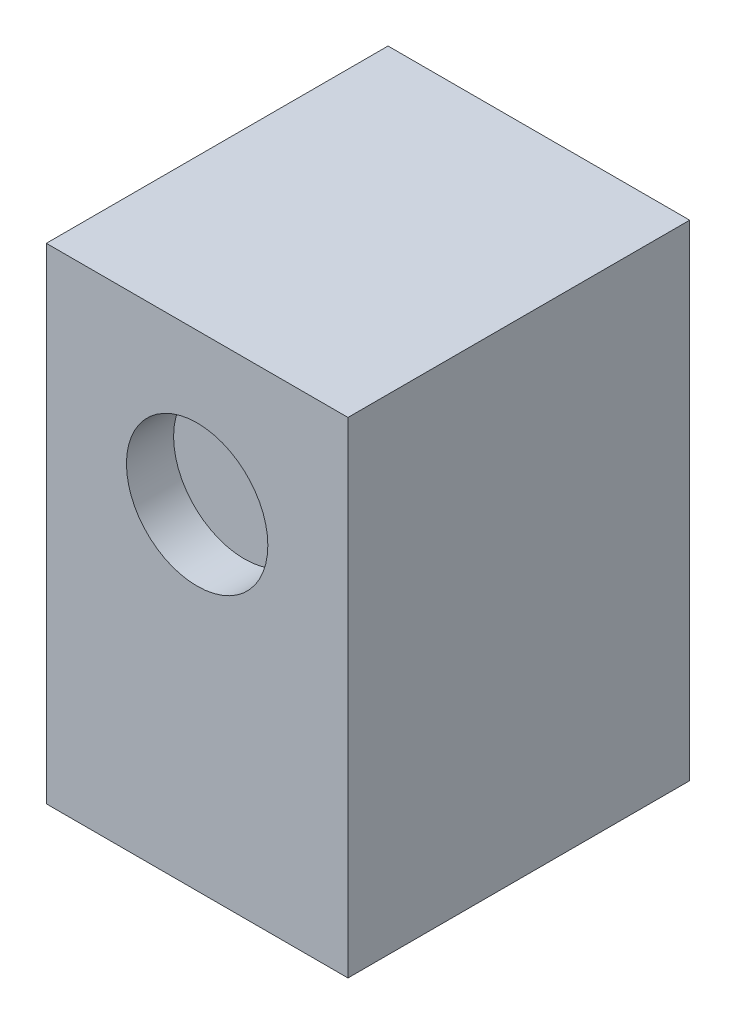
ISO-10303-21;
HEADER;
FILE_DESCRIPTION(('STEP AP214'),'2;1');
FILE_NAME('part.step','',(''),(''),'','','');
FILE_SCHEMA(('AUTOMOTIVE_DESIGN { 1 0 10303 214 1 1 1 1 }'));
ENDSEC;
DATA;
#1=APPLICATION_CONTEXT('core data for automotive mechanical design processes');
#2=APPLICATION_PROTOCOL_DEFINITION('international standard','automotive_design',2000,#1);
#3=PRODUCT_CONTEXT('',#1,'mechanical');
#4=PRODUCT('Part','Part','',(#3));
#5=PRODUCT_RELATED_PRODUCT_CATEGORY('part','',(#4));
#6=PRODUCT_DEFINITION_FORMATION('','',#4);
#7=PRODUCT_DEFINITION_CONTEXT('part definition',#1,'design');
#8=PRODUCT_DEFINITION('design','',#6,#7);
#9=PRODUCT_DEFINITION_SHAPE('','',#8);
#10=(LENGTH_UNIT() NAMED_UNIT(*) SI_UNIT(.MILLI.,.METRE.));
#11=(NAMED_UNIT(*) PLANE_ANGLE_UNIT() SI_UNIT($,.RADIAN.));
#12=(NAMED_UNIT(*) SI_UNIT($,.STERADIAN.) SOLID_ANGLE_UNIT());
#13=UNCERTAINTY_MEASURE_WITH_UNIT(LENGTH_MEASURE(1.E-05),#10,'distance_accuracy_value','');
#14=(GEOMETRIC_REPRESENTATION_CONTEXT(3) GLOBAL_UNCERTAINTY_ASSIGNED_CONTEXT((#13)) GLOBAL_UNIT_ASSIGNED_CONTEXT((#10,
#11,#12)) REPRESENTATION_CONTEXT('',''));
#15=CARTESIAN_POINT('',(0.,0.,0.));
#16=DIRECTION('',(0.,0.,1.));
#17=DIRECTION('',(1.,0.,0.));
#18=AXIS2_PLACEMENT_3D('',#15,#16,#17);
#19=CARTESIAN_POINT('',(32.,103.,36.25));
#20=DIRECTION('',(-1.,0.,0.));
#21=DIRECTION('',(0.,0.,1.));
#22=AXIS2_PLACEMENT_3D('',#19,#20,#21);
#23=PLANE('',#22);
#24=DIRECTION('',(0.,0.,-1.));
#25=VECTOR('',#24,1.);
#26=CARTESIAN_POINT('',(32.,0.,36.25));
#27=LINE('',#26,#25);
#28=CARTESIAN_POINT('',(32.,0.,36.25));
#29=VERTEX_POINT('',#28);
#30=CARTESIAN_POINT('',(32.,0.,-36.25));
#31=VERTEX_POINT('',#30);
#32=EDGE_CURVE('E99',#29,#31,#27,.T.);
#33=ORIENTED_EDGE('',*,*,#32,.T.);
#34=DIRECTION('',(0.,-1.,0.));
#35=VECTOR('',#34,1.);
#36=CARTESIAN_POINT('',(32.,103.,-36.25));
#37=LINE('',#36,#35);
#38=CARTESIAN_POINT('',(32.,103.,-36.25));
#39=VERTEX_POINT('',#38);
#40=EDGE_CURVE('E11',#39,#31,#37,.T.);
#41=ORIENTED_EDGE('',*,*,#40,.F.);
#42=DIRECTION('',(0.,0.,-1.));
#43=VECTOR('',#42,1.);
#44=CARTESIAN_POINT('',(32.,103.,36.25));
#45=LINE('',#44,#43);
#46=CARTESIAN_POINT('',(32.,103.,36.25));
#47=VERTEX_POINT('',#46);
#48=EDGE_CURVE('E87',#47,#39,#45,.T.);
#49=ORIENTED_EDGE('',*,*,#48,.F.);
#50=DIRECTION('',(0.,-1.,0.));
#51=VECTOR('',#50,1.);
#52=CARTESIAN_POINT('',(32.,103.,36.25));
#53=LINE('',#52,#51);
#54=EDGE_CURVE('E95',#47,#29,#53,.T.);
#55=ORIENTED_EDGE('',*,*,#54,.T.);
#56=EDGE_LOOP('',(#33,#41,#49,#55));
#57=FACE_BOUND('',#56,.T.);
#58=ADVANCED_FACE('F36',(#57),#23,.F.);
#59=CARTESIAN_POINT('',(-32.,103.,-36.25));
#60=DIRECTION('',(0.,0.,1.));
#61=DIRECTION('',(1.,0.,0.));
#62=AXIS2_PLACEMENT_3D('',#59,#60,#61);
#63=PLANE('',#62);
#64=DIRECTION('',(-1.,0.,0.));
#65=VECTOR('',#64,1.);
#66=CARTESIAN_POINT('',(-32.,0.,-36.25));
#67=LINE('',#66,#65);
#68=CARTESIAN_POINT('',(-32.,0.,-36.25));
#69=VERTEX_POINT('',#68);
#70=EDGE_CURVE('E91',#31,#69,#67,.T.);
#71=ORIENTED_EDGE('',*,*,#70,.T.);
#72=DIRECTION('',(0.,-1.,0.));
#73=VECTOR('',#72,1.);
#74=CARTESIAN_POINT('',(-32.,103.,-36.25));
#75=LINE('',#74,#73);
#76=CARTESIAN_POINT('',(-32.,103.,-36.25));
#77=VERTEX_POINT('',#76);
#78=EDGE_CURVE('E44',#77,#69,#75,.T.);
#79=ORIENTED_EDGE('',*,*,#78,.F.);
#80=DIRECTION('',(-1.,0.,0.));
#81=VECTOR('',#80,1.);
#82=CARTESIAN_POINT('',(-32.,103.,-36.25));
#83=LINE('',#82,#81);
#84=EDGE_CURVE('E82',#39,#77,#83,.T.);
#85=ORIENTED_EDGE('',*,*,#84,.F.);
#86=ORIENTED_EDGE('',*,*,#40,.T.);
#87=EDGE_LOOP('',(#71,#79,#85,#86));
#88=FACE_BOUND('',#87,.T.);
#89=ADVANCED_FACE('F90',(#88),#63,.F.);
#90=CARTESIAN_POINT('',(-32.,103.,36.25));
#91=DIRECTION('',(1.,0.,0.));
#92=DIRECTION('',(0.,0.,-1.));
#93=AXIS2_PLACEMENT_3D('',#90,#91,#92);
#94=PLANE('',#93);
#95=DIRECTION('',(0.,0.,1.));
#96=VECTOR('',#95,1.);
#97=CARTESIAN_POINT('',(-32.,0.,36.25));
#98=LINE('',#97,#96);
#99=CARTESIAN_POINT('',(-32.,0.,36.25));
#100=VERTEX_POINT('',#99);
#101=EDGE_CURVE('E69',#69,#100,#98,.T.);
#102=ORIENTED_EDGE('',*,*,#101,.T.);
#103=DIRECTION('',(0.,-1.,0.));
#104=VECTOR('',#103,1.);
#105=CARTESIAN_POINT('',(-32.,103.,36.25));
#106=LINE('',#105,#104);
#107=CARTESIAN_POINT('',(-32.,103.,36.25));
#108=VERTEX_POINT('',#107);
#109=EDGE_CURVE('E92',#108,#100,#106,.T.);
#110=ORIENTED_EDGE('',*,*,#109,.F.);
#111=DIRECTION('',(0.,0.,1.));
#112=VECTOR('',#111,1.);
#113=CARTESIAN_POINT('',(-32.,103.,36.25));
#114=LINE('',#113,#112);
#115=EDGE_CURVE('E85',#77,#108,#114,.T.);
#116=ORIENTED_EDGE('',*,*,#115,.F.);
#117=ORIENTED_EDGE('',*,*,#78,.T.);
#118=EDGE_LOOP('',(#102,#110,#116,#117));
#119=FACE_BOUND('',#118,.T.);
#120=ADVANCED_FACE('F93',(#119),#94,.F.);
#121=CARTESIAN_POINT('',(-32.,103.,36.25));
#122=DIRECTION('',(0.,0.,-1.));
#123=DIRECTION('',(-1.,0.,0.));
#124=AXIS2_PLACEMENT_3D('',#121,#122,#123);
#125=PLANE('',#124);
#126=CARTESIAN_POINT('',(0.,71.,36.25));
#127=DIRECTION('',(0.,0.,1.));
#128=DIRECTION('',(1.,0.,0.));
#129=AXIS2_PLACEMENT_3D('',#126,#127,#128);
#130=CIRCLE('',#129,15.);
#131=CARTESIAN_POINT('',(15.,71.,36.25));
#132=VERTEX_POINT('',#131);
#133=EDGE_CURVE('E113',#132,#132,#130,.T.);
#134=ORIENTED_EDGE('',*,*,#133,.F.);
#135=EDGE_LOOP('',(#134));
#136=FACE_BOUND('',#135,.T.);
#137=DIRECTION('',(1.,0.,0.));
#138=VECTOR('',#137,1.);
#139=CARTESIAN_POINT('',(-32.,0.,36.25));
#140=LINE('',#139,#138);
#141=EDGE_CURVE('E75',#100,#29,#140,.T.);
#142=ORIENTED_EDGE('',*,*,#141,.T.);
#143=ORIENTED_EDGE('',*,*,#54,.F.);
#144=DIRECTION('',(1.,0.,0.));
#145=VECTOR('',#144,1.);
#146=CARTESIAN_POINT('',(-32.,103.,36.25));
#147=LINE('',#146,#145);
#148=EDGE_CURVE('E52',#108,#47,#147,.T.);
#149=ORIENTED_EDGE('',*,*,#148,.F.);
#150=ORIENTED_EDGE('',*,*,#109,.T.);
#151=EDGE_LOOP('',(#142,#143,#149,#150));
#152=FACE_BOUND('',#151,.T.);
#153=ADVANCED_FACE('F107',(#136,#152),#125,.F.);
#154=CARTESIAN_POINT('',(0.,103.,0.));
#155=DIRECTION('',(0.,-1.,0.));
#156=DIRECTION('',(0.,0.,-1.));
#157=AXIS2_PLACEMENT_3D('',#154,#155,#156);
#158=PLANE('',#157);
#159=ORIENTED_EDGE('',*,*,#48,.T.);
#160=ORIENTED_EDGE('',*,*,#84,.T.);
#161=ORIENTED_EDGE('',*,*,#115,.T.);
#162=ORIENTED_EDGE('',*,*,#148,.T.);
#163=EDGE_LOOP('',(#159,#160,#161,#162));
#164=FACE_BOUND('',#163,.T.);
#165=ADVANCED_FACE('F83',(#164),#158,.F.);
#166=CARTESIAN_POINT('',(0.,0.,0.));
#167=DIRECTION('',(0.,-1.,0.));
#168=DIRECTION('',(0.,0.,-1.));
#169=AXIS2_PLACEMENT_3D('',#166,#167,#168);
#170=PLANE('',#169);
#171=CARTESIAN_POINT('',(0.,0.,0.));
#172=DIRECTION('',(0.,-1.,0.));
#173=DIRECTION('',(0.,0.,-1.));
#174=AXIS2_PLACEMENT_3D('',#171,#172,#173);
#175=CIRCLE('',#174,15.);
#176=CARTESIAN_POINT('',(0.,0.,-15.));
#177=VERTEX_POINT('',#176);
#178=EDGE_CURVE('E119',#177,#177,#175,.T.);
#179=ORIENTED_EDGE('',*,*,#178,.F.);
#180=EDGE_LOOP('',(#179));
#181=FACE_BOUND('',#180,.T.);
#182=ORIENTED_EDGE('',*,*,#32,.F.);
#183=ORIENTED_EDGE('',*,*,#141,.F.);
#184=ORIENTED_EDGE('',*,*,#101,.F.);
#185=ORIENTED_EDGE('',*,*,#70,.F.);
#186=EDGE_LOOP('',(#182,#183,#184,#185));
#187=FACE_BOUND('',#186,.T.);
#188=ADVANCED_FACE('F110',(#181,#187),#170,.T.);
#189=CARTESIAN_POINT('',(0.,71.,26.25));
#190=DIRECTION('',(0.,0.,1.));
#191=DIRECTION('',(1.,0.,0.));
#192=AXIS2_PLACEMENT_3D('',#189,#190,#191);
#193=CYLINDRICAL_SURFACE('',#192,15.);
#194=CARTESIAN_POINT('',(0.,71.,26.25));
#195=DIRECTION('',(0.,0.,1.));
#196=DIRECTION('',(1.,0.,0.));
#197=AXIS2_PLACEMENT_3D('',#194,#195,#196);
#198=CIRCLE('',#197,15.);
#199=CARTESIAN_POINT('',(15.,71.,26.25));
#200=VERTEX_POINT('',#199);
#201=EDGE_CURVE('E102',#200,#200,#198,.T.);
#202=ORIENTED_EDGE('',*,*,#201,.F.);
#203=EDGE_LOOP('',(#202));
#204=FACE_BOUND('',#203,.T.);
#205=ORIENTED_EDGE('',*,*,#133,.T.);
#206=EDGE_LOOP('',(#205));
#207=FACE_BOUND('',#206,.T.);
#208=ADVANCED_FACE('F135',(#204,#207),#193,.F.);
#209=CARTESIAN_POINT('',(0.,71.,26.25));
#210=DIRECTION('',(0.,0.,1.));
#211=DIRECTION('',(1.,0.,0.));
#212=AXIS2_PLACEMENT_3D('',#209,#210,#211);
#213=PLANE('',#212);
#214=ORIENTED_EDGE('',*,*,#201,.T.);
#215=EDGE_LOOP('',(#214));
#216=FACE_BOUND('',#215,.T.);
#217=ADVANCED_FACE('F130',(#216),#213,.T.);
#218=CARTESIAN_POINT('',(0.,10.,0.));
#219=DIRECTION('',(0.,-1.,0.));
#220=DIRECTION('',(0.,0.,-1.));
#221=AXIS2_PLACEMENT_3D('',#218,#219,#220);
#222=CYLINDRICAL_SURFACE('',#221,15.);
#223=CARTESIAN_POINT('',(0.,10.,0.));
#224=DIRECTION('',(0.,-1.,0.));
#225=DIRECTION('',(0.,0.,-1.));
#226=AXIS2_PLACEMENT_3D('',#223,#224,#225);
#227=CIRCLE('',#226,15.);
#228=CARTESIAN_POINT('',(0.,10.,-15.));
#229=VERTEX_POINT('',#228);
#230=EDGE_CURVE('E116',#229,#229,#227,.T.);
#231=ORIENTED_EDGE('',*,*,#230,.F.);
#232=EDGE_LOOP('',(#231));
#233=FACE_BOUND('',#232,.T.);
#234=ORIENTED_EDGE('',*,*,#178,.T.);
#235=EDGE_LOOP('',(#234));
#236=FACE_BOUND('',#235,.T.);
#237=ADVANCED_FACE('F127',(#233,#236),#222,.F.);
#238=CARTESIAN_POINT('',(0.,10.,0.));
#239=DIRECTION('',(0.,-1.,0.));
#240=DIRECTION('',(0.,0.,-1.));
#241=AXIS2_PLACEMENT_3D('',#238,#239,#240);
#242=PLANE('',#241);
#243=ORIENTED_EDGE('',*,*,#230,.T.);
#244=EDGE_LOOP('',(#243));
#245=FACE_BOUND('',#244,.T.);
#246=ADVANCED_FACE('F125',(#245),#242,.T.);
#247=CLOSED_SHELL('',(#58,#89,#120,#153,#165,#188,#208,#217,#237,#246));
#248=MANIFOLD_SOLID_BREP('B2',#247);
#249=ADVANCED_BREP_SHAPE_REPRESENTATION('',(#18,#248),#14);
#250=SHAPE_DEFINITION_REPRESENTATION(#9,#249);
ENDSEC;
END-ISO-10303-21;
